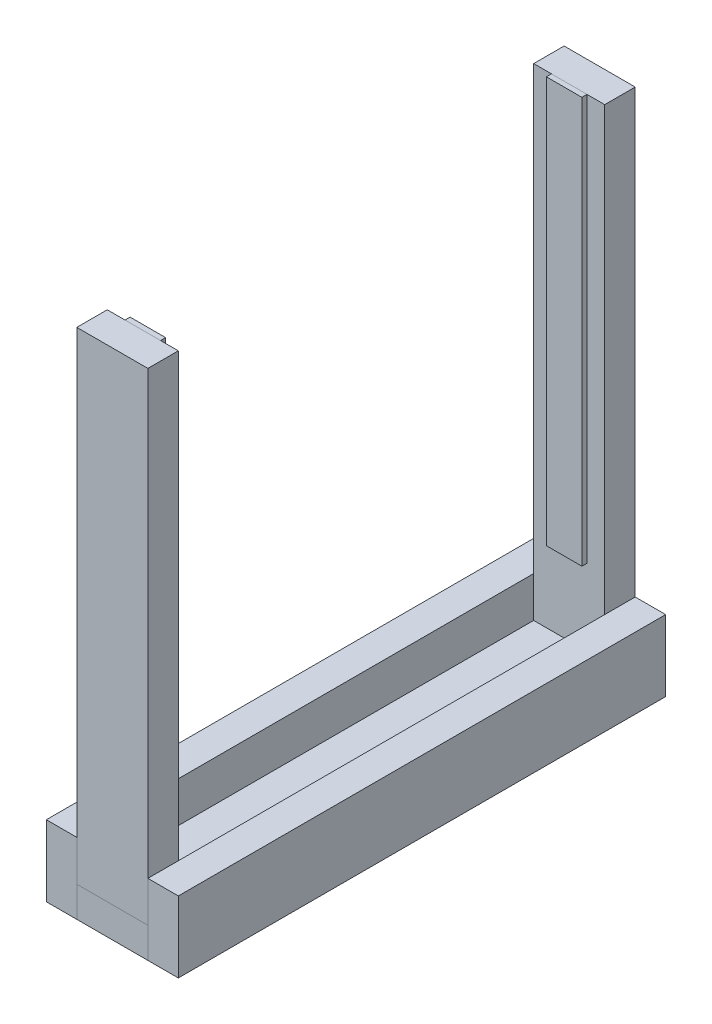
ISO-10303-21;
HEADER;
FILE_DESCRIPTION(('STEP AP214'),'2;1');
FILE_NAME('part.step','',(''),(''),'','','');
FILE_SCHEMA(('AUTOMOTIVE_DESIGN { 1 0 10303 214 1 1 1 1 }'));
ENDSEC;
DATA;
#1=APPLICATION_CONTEXT('core data for automotive mechanical design processes');
#2=APPLICATION_PROTOCOL_DEFINITION('international standard','automotive_design',2000,#1);
#3=PRODUCT_CONTEXT('',#1,'mechanical');
#4=PRODUCT('Part','Part','',(#3));
#5=PRODUCT_RELATED_PRODUCT_CATEGORY('part','',(#4));
#6=PRODUCT_DEFINITION_FORMATION('','',#4);
#7=PRODUCT_DEFINITION_CONTEXT('part definition',#1,'design');
#8=PRODUCT_DEFINITION('design','',#6,#7);
#9=PRODUCT_DEFINITION_SHAPE('','',#8);
#10=(LENGTH_UNIT() NAMED_UNIT(*) SI_UNIT(.MILLI.,.METRE.));
#11=(NAMED_UNIT(*) PLANE_ANGLE_UNIT() SI_UNIT($,.RADIAN.));
#12=(NAMED_UNIT(*) SI_UNIT($,.STERADIAN.) SOLID_ANGLE_UNIT());
#13=UNCERTAINTY_MEASURE_WITH_UNIT(LENGTH_MEASURE(1.E-05),#10,'distance_accuracy_value','');
#14=(GEOMETRIC_REPRESENTATION_CONTEXT(3) GLOBAL_UNCERTAINTY_ASSIGNED_CONTEXT((#13)) GLOBAL_UNIT_ASSIGNED_CONTEXT((#10,
#11,#12)) REPRESENTATION_CONTEXT('',''));
#15=CARTESIAN_POINT('',(0.,0.,0.));
#16=DIRECTION('',(0.,0.,1.));
#17=DIRECTION('',(1.,0.,0.));
#18=AXIS2_PLACEMENT_3D('',#15,#16,#17);
#19=CARTESIAN_POINT('',(22.225,641.35,-260.35));
#20=DIRECTION('',(-1.,0.,0.));
#21=DIRECTION('',(0.,-1.,0.));
#22=AXIS2_PLACEMENT_3D('',#19,#20,#21);
#23=PLANE('',#22);
#24=DIRECTION('',(0.,-1.,0.));
#25=VECTOR('',#24,1.);
#26=CARTESIAN_POINT('',(22.225,641.35,-266.7));
#27=LINE('',#26,#25);
#28=CARTESIAN_POINT('',(22.225,641.35,-266.7));
#29=VERTEX_POINT('',#28);
#30=CARTESIAN_POINT('',(22.2249999999999,133.35,-266.7));
#31=VERTEX_POINT('',#30);
#32=EDGE_CURVE('E109',#29,#31,#27,.T.);
#33=ORIENTED_EDGE('',*,*,#32,.F.);
#34=DIRECTION('',(0.,0.,-1.));
#35=VECTOR('',#34,1.);
#36=CARTESIAN_POINT('',(22.225,641.35,-260.35));
#37=LINE('',#36,#35);
#38=CARTESIAN_POINT('',(22.225,641.35,-260.35));
#39=VERTEX_POINT('',#38);
#40=EDGE_CURVE('E108',#39,#29,#37,.T.);
#41=ORIENTED_EDGE('',*,*,#40,.F.);
#42=DIRECTION('',(0.,-1.,0.));
#43=VECTOR('',#42,1.);
#44=CARTESIAN_POINT('',(22.225,641.35,-260.35));
#45=LINE('',#44,#43);
#46=CARTESIAN_POINT('',(22.2249999999999,133.35,-260.35));
#47=VERTEX_POINT('',#46);
#48=EDGE_CURVE('E103',#39,#47,#45,.T.);
#49=ORIENTED_EDGE('',*,*,#48,.T.);
#50=DIRECTION('',(0.,0.,-1.));
#51=VECTOR('',#50,1.);
#52=CARTESIAN_POINT('',(22.2249999999999,133.35,-260.35));
#53=LINE('',#52,#51);
#54=EDGE_CURVE('E12',#47,#31,#53,.T.);
#55=ORIENTED_EDGE('',*,*,#54,.T.);
#56=EDGE_LOOP('',(#33,#41,#49,#55));
#57=FACE_BOUND('',#56,.T.);
#58=ADVANCED_FACE('F46',(#57),#23,.F.);
#59=CARTESIAN_POINT('',(22.2249999999999,133.35,-260.35));
#60=DIRECTION('',(0.,1.,0.));
#61=DIRECTION('',(0.,0.,-1.));
#62=AXIS2_PLACEMENT_3D('',#59,#60,#61);
#63=PLANE('',#62);
#64=DIRECTION('',(-1.,0.,0.));
#65=VECTOR('',#64,1.);
#66=CARTESIAN_POINT('',(22.2249999999999,133.35,-266.7));
#67=LINE('',#66,#65);
#68=CARTESIAN_POINT('',(-22.2249999999999,133.35,-266.7));
#69=VERTEX_POINT('',#68);
#70=EDGE_CURVE('E111',#31,#69,#67,.T.);
#71=ORIENTED_EDGE('',*,*,#70,.F.);
#72=ORIENTED_EDGE('',*,*,#54,.F.);
#73=DIRECTION('',(-1.,0.,0.));
#74=VECTOR('',#73,1.);
#75=CARTESIAN_POINT('',(22.2249999999999,133.35,-260.35));
#76=LINE('',#75,#74);
#77=CARTESIAN_POINT('',(-22.2249999999999,133.35,-260.35));
#78=VERTEX_POINT('',#77);
#79=EDGE_CURVE('E87',#47,#78,#76,.T.);
#80=ORIENTED_EDGE('',*,*,#79,.T.);
#81=DIRECTION('',(0.,0.,-1.));
#82=VECTOR('',#81,1.);
#83=CARTESIAN_POINT('',(-22.2249999999999,133.35,-260.35));
#84=LINE('',#83,#82);
#85=EDGE_CURVE('E54',#78,#69,#84,.T.);
#86=ORIENTED_EDGE('',*,*,#85,.T.);
#87=EDGE_LOOP('',(#71,#72,#80,#86));
#88=FACE_BOUND('',#87,.T.);
#89=ADVANCED_FACE('F101',(#88),#63,.F.);
#90=CARTESIAN_POINT('',(-22.225,641.35,-260.35));
#91=DIRECTION('',(1.,0.,0.));
#92=DIRECTION('',(0.,1.,0.));
#93=AXIS2_PLACEMENT_3D('',#90,#91,#92);
#94=PLANE('',#93);
#95=DIRECTION('',(0.,1.,0.));
#96=VECTOR('',#95,1.);
#97=CARTESIAN_POINT('',(-22.225,641.35,-266.7));
#98=LINE('',#97,#96);
#99=CARTESIAN_POINT('',(-22.225,641.35,-266.7));
#100=VERTEX_POINT('',#99);
#101=EDGE_CURVE('E97',#69,#100,#98,.T.);
#102=ORIENTED_EDGE('',*,*,#101,.F.);
#103=ORIENTED_EDGE('',*,*,#85,.F.);
#104=DIRECTION('',(0.,1.,0.));
#105=VECTOR('',#104,1.);
#106=CARTESIAN_POINT('',(-22.225,641.35,-260.35));
#107=LINE('',#106,#105);
#108=CARTESIAN_POINT('',(-22.225,641.35,-260.35));
#109=VERTEX_POINT('',#108);
#110=EDGE_CURVE('E90',#78,#109,#107,.T.);
#111=ORIENTED_EDGE('',*,*,#110,.T.);
#112=DIRECTION('',(0.,0.,-1.));
#113=VECTOR('',#112,1.);
#114=CARTESIAN_POINT('',(-22.225,641.35,-260.35));
#115=LINE('',#114,#113);
#116=EDGE_CURVE('E100',#109,#100,#115,.T.);
#117=ORIENTED_EDGE('',*,*,#116,.T.);
#118=EDGE_LOOP('',(#102,#103,#111,#117));
#119=FACE_BOUND('',#118,.T.);
#120=ADVANCED_FACE('F96',(#119),#94,.F.);
#121=CARTESIAN_POINT('',(22.225,641.35,-260.35));
#122=DIRECTION('',(0.,-1.,0.));
#123=DIRECTION('',(0.,0.,1.));
#124=AXIS2_PLACEMENT_3D('',#121,#122,#123);
#125=PLANE('',#124);
#126=DIRECTION('',(1.,0.,0.));
#127=VECTOR('',#126,1.);
#128=CARTESIAN_POINT('',(22.225,641.35,-266.7));
#129=LINE('',#128,#127);
#130=EDGE_CURVE('E76',#100,#29,#129,.T.);
#131=ORIENTED_EDGE('',*,*,#130,.F.);
#132=ORIENTED_EDGE('',*,*,#116,.F.);
#133=DIRECTION('',(1.,0.,0.));
#134=VECTOR('',#133,1.);
#135=CARTESIAN_POINT('',(22.225,641.35,-260.35));
#136=LINE('',#135,#134);
#137=EDGE_CURVE('E62',#109,#39,#136,.T.);
#138=ORIENTED_EDGE('',*,*,#137,.T.);
#139=ORIENTED_EDGE('',*,*,#40,.T.);
#140=EDGE_LOOP('',(#131,#132,#138,#139));
#141=FACE_BOUND('',#140,.T.);
#142=ADVANCED_FACE('F120',(#141),#125,.F.);
#143=CARTESIAN_POINT('',(0.,0.,-260.35));
#144=DIRECTION('',(0.,0.,1.));
#145=DIRECTION('',(-1.,0.,0.));
#146=AXIS2_PLACEMENT_3D('',#143,#144,#145);
#147=PLANE('',#146);
#148=ORIENTED_EDGE('',*,*,#48,.F.);
#149=ORIENTED_EDGE('',*,*,#137,.F.);
#150=ORIENTED_EDGE('',*,*,#110,.F.);
#151=ORIENTED_EDGE('',*,*,#79,.F.);
#152=EDGE_LOOP('',(#148,#149,#150,#151));
#153=FACE_BOUND('',#152,.T.);
#154=ADVANCED_FACE('F92',(#153),#147,.T.);
#155=CARTESIAN_POINT('',(0.,0.,-266.7));
#156=DIRECTION('',(0.,0.,1.));
#157=DIRECTION('',(-1.,0.,0.));
#158=AXIS2_PLACEMENT_3D('',#155,#156,#157);
#159=PLANE('',#158);
#160=ORIENTED_EDGE('',*,*,#32,.T.);
#161=ORIENTED_EDGE('',*,*,#70,.T.);
#162=ORIENTED_EDGE('',*,*,#101,.T.);
#163=ORIENTED_EDGE('',*,*,#130,.T.);
#164=EDGE_LOOP('',(#160,#161,#162,#163));
#165=FACE_BOUND('',#164,.T.);
#166=ADVANCED_FACE('F116',(#165),#159,.F.);
#167=CLOSED_SHELL('',(#58,#89,#120,#142,#154,#166));
#168=MANIFOLD_SOLID_BREP('B2',#167);
#169=CARTESIAN_POINT('',(22.225,641.35,260.35));
#170=DIRECTION('',(-1.,0.,0.));
#171=DIRECTION('',(0.,-1.,0.));
#172=AXIS2_PLACEMENT_3D('',#169,#170,#171);
#173=PLANE('',#172);
#174=DIRECTION('',(0.,-1.,0.));
#175=VECTOR('',#174,1.);
#176=CARTESIAN_POINT('',(22.225,641.35,266.7));
#177=LINE('',#176,#175);
#178=CARTESIAN_POINT('',(22.225,641.35,266.7));
#179=VERTEX_POINT('',#178);
#180=CARTESIAN_POINT('',(22.2249999999999,133.35,266.7));
#181=VERTEX_POINT('',#180);
#182=EDGE_CURVE('E255',#179,#181,#177,.T.);
#183=ORIENTED_EDGE('',*,*,#182,.T.);
#184=DIRECTION('',(0.,0.,1.));
#185=VECTOR('',#184,1.);
#186=CARTESIAN_POINT('',(22.2249999999999,133.35,260.35));
#187=LINE('',#186,#185);
#188=CARTESIAN_POINT('',(22.2249999999999,133.35,260.35));
#189=VERTEX_POINT('',#188);
#190=EDGE_CURVE('E44',#189,#181,#187,.T.);
#191=ORIENTED_EDGE('',*,*,#190,.F.);
#192=DIRECTION('',(0.,-1.,0.));
#193=VECTOR('',#192,1.);
#194=CARTESIAN_POINT('',(22.225,641.35,260.35));
#195=LINE('',#194,#193);
#196=CARTESIAN_POINT('',(22.225,641.35,260.35));
#197=VERTEX_POINT('',#196);
#198=EDGE_CURVE('E243',#197,#189,#195,.T.);
#199=ORIENTED_EDGE('',*,*,#198,.F.);
#200=DIRECTION('',(0.,0.,1.));
#201=VECTOR('',#200,1.);
#202=CARTESIAN_POINT('',(22.225,641.35,260.35));
#203=LINE('',#202,#201);
#204=EDGE_CURVE('E251',#197,#179,#203,.T.);
#205=ORIENTED_EDGE('',*,*,#204,.T.);
#206=EDGE_LOOP('',(#183,#191,#199,#205));
#207=FACE_BOUND('',#206,.T.);
#208=ADVANCED_FACE('F192',(#207),#173,.F.);
#209=CARTESIAN_POINT('',(22.2249999999999,133.35,260.35));
#210=DIRECTION('',(0.,1.,0.));
#211=DIRECTION('',(0.,0.,1.));
#212=AXIS2_PLACEMENT_3D('',#209,#210,#211);
#213=PLANE('',#212);
#214=DIRECTION('',(-1.,0.,0.));
#215=VECTOR('',#214,1.);
#216=CARTESIAN_POINT('',(22.2249999999999,133.35,266.7));
#217=LINE('',#216,#215);
#218=CARTESIAN_POINT('',(-22.2249999999999,133.35,266.7));
#219=VERTEX_POINT('',#218);
#220=EDGE_CURVE('E247',#181,#219,#217,.T.);
#221=ORIENTED_EDGE('',*,*,#220,.T.);
#222=DIRECTION('',(0.,0.,1.));
#223=VECTOR('',#222,1.);
#224=CARTESIAN_POINT('',(-22.2249999999999,133.35,260.35));
#225=LINE('',#224,#223);
#226=CARTESIAN_POINT('',(-22.2249999999999,133.35,260.35));
#227=VERTEX_POINT('',#226);
#228=EDGE_CURVE('E200',#227,#219,#225,.T.);
#229=ORIENTED_EDGE('',*,*,#228,.F.);
#230=DIRECTION('',(-1.,0.,0.));
#231=VECTOR('',#230,1.);
#232=CARTESIAN_POINT('',(22.2249999999999,133.35,260.35));
#233=LINE('',#232,#231);
#234=EDGE_CURVE('E238',#189,#227,#233,.T.);
#235=ORIENTED_EDGE('',*,*,#234,.F.);
#236=ORIENTED_EDGE('',*,*,#190,.T.);
#237=EDGE_LOOP('',(#221,#229,#235,#236));
#238=FACE_BOUND('',#237,.T.);
#239=ADVANCED_FACE('F246',(#238),#213,.F.);
#240=CARTESIAN_POINT('',(-22.225,641.35,260.35));
#241=DIRECTION('',(1.,0.,0.));
#242=DIRECTION('',(0.,1.,0.));
#243=AXIS2_PLACEMENT_3D('',#240,#241,#242);
#244=PLANE('',#243);
#245=DIRECTION('',(0.,1.,0.));
#246=VECTOR('',#245,1.);
#247=CARTESIAN_POINT('',(-22.225,641.35,266.7));
#248=LINE('',#247,#246);
#249=CARTESIAN_POINT('',(-22.225,641.35,266.7));
#250=VERTEX_POINT('',#249);
#251=EDGE_CURVE('E225',#219,#250,#248,.T.);
#252=ORIENTED_EDGE('',*,*,#251,.T.);
#253=DIRECTION('',(0.,0.,1.));
#254=VECTOR('',#253,1.);
#255=CARTESIAN_POINT('',(-22.225,641.35,260.35));
#256=LINE('',#255,#254);
#257=CARTESIAN_POINT('',(-22.225,641.35,260.35));
#258=VERTEX_POINT('',#257);
#259=EDGE_CURVE('E248',#258,#250,#256,.T.);
#260=ORIENTED_EDGE('',*,*,#259,.F.);
#261=DIRECTION('',(0.,1.,0.));
#262=VECTOR('',#261,1.);
#263=CARTESIAN_POINT('',(-22.225,641.35,260.35));
#264=LINE('',#263,#262);
#265=EDGE_CURVE('E241',#227,#258,#264,.T.);
#266=ORIENTED_EDGE('',*,*,#265,.F.);
#267=ORIENTED_EDGE('',*,*,#228,.T.);
#268=EDGE_LOOP('',(#252,#260,#266,#267));
#269=FACE_BOUND('',#268,.T.);
#270=ADVANCED_FACE('F249',(#269),#244,.F.);
#271=CARTESIAN_POINT('',(22.225,641.35,260.35));
#272=DIRECTION('',(0.,-1.,0.));
#273=DIRECTION('',(0.,0.,-1.));
#274=AXIS2_PLACEMENT_3D('',#271,#272,#273);
#275=PLANE('',#274);
#276=DIRECTION('',(1.,0.,0.));
#277=VECTOR('',#276,1.);
#278=CARTESIAN_POINT('',(22.225,641.35,266.7));
#279=LINE('',#278,#277);
#280=EDGE_CURVE('E231',#250,#179,#279,.T.);
#281=ORIENTED_EDGE('',*,*,#280,.T.);
#282=ORIENTED_EDGE('',*,*,#204,.F.);
#283=DIRECTION('',(1.,0.,0.));
#284=VECTOR('',#283,1.);
#285=CARTESIAN_POINT('',(22.225,641.35,260.35));
#286=LINE('',#285,#284);
#287=EDGE_CURVE('E208',#258,#197,#286,.T.);
#288=ORIENTED_EDGE('',*,*,#287,.F.);
#289=ORIENTED_EDGE('',*,*,#259,.T.);
#290=EDGE_LOOP('',(#281,#282,#288,#289));
#291=FACE_BOUND('',#290,.T.);
#292=ADVANCED_FACE('F262',(#291),#275,.F.);
#293=CARTESIAN_POINT('',(0.,0.,260.35));
#294=DIRECTION('',(0.,0.,-1.));
#295=DIRECTION('',(-1.,0.,0.));
#296=AXIS2_PLACEMENT_3D('',#293,#294,#295);
#297=PLANE('',#296);
#298=ORIENTED_EDGE('',*,*,#198,.T.);
#299=ORIENTED_EDGE('',*,*,#234,.T.);
#300=ORIENTED_EDGE('',*,*,#265,.T.);
#301=ORIENTED_EDGE('',*,*,#287,.T.);
#302=EDGE_LOOP('',(#298,#299,#300,#301));
#303=FACE_BOUND('',#302,.T.);
#304=ADVANCED_FACE('F239',(#303),#297,.T.);
#305=CARTESIAN_POINT('',(0.,0.,266.7));
#306=DIRECTION('',(0.,0.,-1.));
#307=DIRECTION('',(-1.,0.,0.));
#308=AXIS2_PLACEMENT_3D('',#305,#306,#307);
#309=PLANE('',#308);
#310=ORIENTED_EDGE('',*,*,#182,.F.);
#311=ORIENTED_EDGE('',*,*,#280,.F.);
#312=ORIENTED_EDGE('',*,*,#251,.F.);
#313=ORIENTED_EDGE('',*,*,#220,.F.);
#314=EDGE_LOOP('',(#310,#311,#312,#313));
#315=FACE_BOUND('',#314,.T.);
#316=ADVANCED_FACE('F265',(#315),#309,.F.);
#317=CLOSED_SHELL('',(#208,#239,#270,#292,#304,#316));
#318=MANIFOLD_SOLID_BREP('B6',#317);
#319=CARTESIAN_POINT('',(-82.55,0.,304.8));
#320=DIRECTION('',(0.,0.,-1.));
#321=DIRECTION('',(1.,0.,0.));
#322=AXIS2_PLACEMENT_3D('',#319,#320,#321);
#323=PLANE('',#322);
#324=DIRECTION('',(0.,-1.,0.));
#325=VECTOR('',#324,1.);
#326=CARTESIAN_POINT('',(-44.45,0.,304.8));
#327=LINE('',#326,#325);
#328=CARTESIAN_POINT('',(-44.45,88.9,304.8));
#329=VERTEX_POINT('',#328);
#330=CARTESIAN_POINT('',(-44.45,0.,304.8));
#331=VERTEX_POINT('',#330);
#332=EDGE_CURVE('E389',#329,#331,#327,.T.);
#333=ORIENTED_EDGE('',*,*,#332,.F.);
#334=DIRECTION('',(1.,0.,0.));
#335=VECTOR('',#334,1.);
#336=CARTESIAN_POINT('',(-82.55,88.9,304.8));
#337=LINE('',#336,#335);
#338=CARTESIAN_POINT('',(-82.55,88.9,304.8));
#339=VERTEX_POINT('',#338);
#340=EDGE_CURVE('E388',#339,#329,#337,.T.);
#341=ORIENTED_EDGE('',*,*,#340,.F.);
#342=DIRECTION('',(0.,-1.,0.));
#343=VECTOR('',#342,1.);
#344=CARTESIAN_POINT('',(-82.55,0.,304.8));
#345=LINE('',#344,#343);
#346=CARTESIAN_POINT('',(-82.55,0.,304.8));
#347=VERTEX_POINT('',#346);
#348=EDGE_CURVE('E383',#339,#347,#345,.T.);
#349=ORIENTED_EDGE('',*,*,#348,.T.);
#350=DIRECTION('',(1.,0.,0.));
#351=VECTOR('',#350,1.);
#352=CARTESIAN_POINT('',(-82.55,0.,304.8));
#353=LINE('',#352,#351);
#354=EDGE_CURVE('E190',#347,#331,#353,.T.);
#355=ORIENTED_EDGE('',*,*,#354,.T.);
#356=EDGE_LOOP('',(#333,#341,#349,#355));
#357=FACE_BOUND('',#356,.T.);
#358=ADVANCED_FACE('F326',(#357),#323,.F.);
#359=CARTESIAN_POINT('',(-82.55,0.,304.8));
#360=DIRECTION('',(0.,1.,0.));
#361=DIRECTION('',(0.,0.,1.));
#362=AXIS2_PLACEMENT_3D('',#359,#360,#361);
#363=PLANE('',#362);
#364=DIRECTION('',(0.,0.,-1.));
#365=VECTOR('',#364,1.);
#366=CARTESIAN_POINT('',(-44.45,0.,304.8));
#367=LINE('',#366,#365);
#368=CARTESIAN_POINT('',(-44.45,0.,-304.8));
#369=VERTEX_POINT('',#368);
#370=EDGE_CURVE('E391',#331,#369,#367,.T.);
#371=ORIENTED_EDGE('',*,*,#370,.F.);
#372=ORIENTED_EDGE('',*,*,#354,.F.);
#373=DIRECTION('',(0.,0.,-1.));
#374=VECTOR('',#373,1.);
#375=CARTESIAN_POINT('',(-82.55,0.,304.8));
#376=LINE('',#375,#374);
#377=CARTESIAN_POINT('',(-82.55,0.,-304.8));
#378=VERTEX_POINT('',#377);
#379=EDGE_CURVE('E367',#347,#378,#376,.T.);
#380=ORIENTED_EDGE('',*,*,#379,.T.);
#381=DIRECTION('',(1.,0.,0.));
#382=VECTOR('',#381,1.);
#383=CARTESIAN_POINT('',(-82.55,0.,-304.8));
#384=LINE('',#383,#382);
#385=EDGE_CURVE('E334',#378,#369,#384,.T.);
#386=ORIENTED_EDGE('',*,*,#385,.T.);
#387=EDGE_LOOP('',(#371,#372,#380,#386));
#388=FACE_BOUND('',#387,.T.);
#389=ADVANCED_FACE('F381',(#388),#363,.F.);
#390=CARTESIAN_POINT('',(-82.55,0.,-304.8));
#391=DIRECTION('',(0.,0.,1.));
#392=DIRECTION('',(-1.,0.,0.));
#393=AXIS2_PLACEMENT_3D('',#390,#391,#392);
#394=PLANE('',#393);
#395=DIRECTION('',(0.,1.,0.));
#396=VECTOR('',#395,1.);
#397=CARTESIAN_POINT('',(-44.45,0.,-304.8));
#398=LINE('',#397,#396);
#399=CARTESIAN_POINT('',(-44.45,88.9,-304.8));
#400=VERTEX_POINT('',#399);
#401=EDGE_CURVE('E377',#369,#400,#398,.T.);
#402=ORIENTED_EDGE('',*,*,#401,.F.);
#403=ORIENTED_EDGE('',*,*,#385,.F.);
#404=DIRECTION('',(0.,1.,0.));
#405=VECTOR('',#404,1.);
#406=CARTESIAN_POINT('',(-82.55,0.,-304.8));
#407=LINE('',#406,#405);
#408=CARTESIAN_POINT('',(-82.55,88.9,-304.8));
#409=VERTEX_POINT('',#408);
#410=EDGE_CURVE('E370',#378,#409,#407,.T.);
#411=ORIENTED_EDGE('',*,*,#410,.T.);
#412=DIRECTION('',(1.,0.,0.));
#413=VECTOR('',#412,1.);
#414=CARTESIAN_POINT('',(-82.55,88.9,-304.8));
#415=LINE('',#414,#413);
#416=EDGE_CURVE('E380',#409,#400,#415,.T.);
#417=ORIENTED_EDGE('',*,*,#416,.T.);
#418=EDGE_LOOP('',(#402,#403,#411,#417));
#419=FACE_BOUND('',#418,.T.);
#420=ADVANCED_FACE('F376',(#419),#394,.F.);
#421=CARTESIAN_POINT('',(-82.55,88.9,304.8));
#422=DIRECTION('',(0.,-1.,0.));
#423=DIRECTION('',(0.,0.,-1.));
#424=AXIS2_PLACEMENT_3D('',#421,#422,#423);
#425=PLANE('',#424);
#426=DIRECTION('',(0.,0.,1.));
#427=VECTOR('',#426,1.);
#428=CARTESIAN_POINT('',(-44.45,88.9,304.8));
#429=LINE('',#428,#427);
#430=EDGE_CURVE('E356',#400,#329,#429,.T.);
#431=ORIENTED_EDGE('',*,*,#430,.F.);
#432=ORIENTED_EDGE('',*,*,#416,.F.);
#433=DIRECTION('',(0.,0.,1.));
#434=VECTOR('',#433,1.);
#435=CARTESIAN_POINT('',(-82.55,88.9,304.8));
#436=LINE('',#435,#434);
#437=EDGE_CURVE('E342',#409,#339,#436,.T.);
#438=ORIENTED_EDGE('',*,*,#437,.T.);
#439=ORIENTED_EDGE('',*,*,#340,.T.);
#440=EDGE_LOOP('',(#431,#432,#438,#439));
#441=FACE_BOUND('',#440,.T.);
#442=ADVANCED_FACE('F400',(#441),#425,.F.);
#443=CARTESIAN_POINT('',(-82.55,0.,0.));
#444=DIRECTION('',(1.,0.,0.));
#445=DIRECTION('',(0.,0.,1.));
#446=AXIS2_PLACEMENT_3D('',#443,#444,#445);
#447=PLANE('',#446);
#448=ORIENTED_EDGE('',*,*,#348,.F.);
#449=ORIENTED_EDGE('',*,*,#437,.F.);
#450=ORIENTED_EDGE('',*,*,#410,.F.);
#451=ORIENTED_EDGE('',*,*,#379,.F.);
#452=EDGE_LOOP('',(#448,#449,#450,#451));
#453=FACE_BOUND('',#452,.T.);
#454=ADVANCED_FACE('F372',(#453),#447,.F.);
#455=CARTESIAN_POINT('',(-44.45,0.,0.));
#456=DIRECTION('',(1.,0.,0.));
#457=DIRECTION('',(0.,0.,1.));
#458=AXIS2_PLACEMENT_3D('',#455,#456,#457);
#459=PLANE('',#458);
#460=ORIENTED_EDGE('',*,*,#332,.T.);
#461=ORIENTED_EDGE('',*,*,#370,.T.);
#462=ORIENTED_EDGE('',*,*,#401,.T.);
#463=ORIENTED_EDGE('',*,*,#430,.T.);
#464=EDGE_LOOP('',(#460,#461,#462,#463));
#465=FACE_BOUND('',#464,.T.);
#466=ADVANCED_FACE('F396',(#465),#459,.T.);
#467=CLOSED_SHELL('',(#358,#389,#420,#442,#454,#466));
#468=MANIFOLD_SOLID_BREP('B38',#467);
#469=CARTESIAN_POINT('',(82.55,0.,304.8));
#470=DIRECTION('',(0.,0.,-1.));
#471=DIRECTION('',(-1.,0.,0.));
#472=AXIS2_PLACEMENT_3D('',#469,#470,#471);
#473=PLANE('',#472);
#474=DIRECTION('',(0.,-1.,0.));
#475=VECTOR('',#474,1.);
#476=CARTESIAN_POINT('',(44.45,0.,304.8));
#477=LINE('',#476,#475);
#478=CARTESIAN_POINT('',(44.45,88.9,304.8));
#479=VERTEX_POINT('',#478);
#480=CARTESIAN_POINT('',(44.45,0.,304.8));
#481=VERTEX_POINT('',#480);
#482=EDGE_CURVE('E523',#479,#481,#477,.T.);
#483=ORIENTED_EDGE('',*,*,#482,.T.);
#484=DIRECTION('',(-1.,0.,0.));
#485=VECTOR('',#484,1.);
#486=CARTESIAN_POINT('',(82.55,0.,304.8));
#487=LINE('',#486,#485);
#488=CARTESIAN_POINT('',(82.55,0.,304.8));
#489=VERTEX_POINT('',#488);
#490=EDGE_CURVE('E324',#489,#481,#487,.T.);
#491=ORIENTED_EDGE('',*,*,#490,.F.);
#492=DIRECTION('',(0.,-1.,0.));
#493=VECTOR('',#492,1.);
#494=CARTESIAN_POINT('',(82.55,0.,304.8));
#495=LINE('',#494,#493);
#496=CARTESIAN_POINT('',(82.55,88.9,304.8));
#497=VERTEX_POINT('',#496);
#498=EDGE_CURVE('E511',#497,#489,#495,.T.);
#499=ORIENTED_EDGE('',*,*,#498,.F.);
#500=DIRECTION('',(-1.,0.,0.));
#501=VECTOR('',#500,1.);
#502=CARTESIAN_POINT('',(82.55,88.9,304.8));
#503=LINE('',#502,#501);
#504=EDGE_CURVE('E519',#497,#479,#503,.T.);
#505=ORIENTED_EDGE('',*,*,#504,.T.);
#506=EDGE_LOOP('',(#483,#491,#499,#505));
#507=FACE_BOUND('',#506,.T.);
#508=ADVANCED_FACE('F460',(#507),#473,.F.);
#509=CARTESIAN_POINT('',(82.55,0.,304.8));
#510=DIRECTION('',(0.,1.,0.));
#511=DIRECTION('',(0.,0.,1.));
#512=AXIS2_PLACEMENT_3D('',#509,#510,#511);
#513=PLANE('',#512);
#514=DIRECTION('',(0.,0.,-1.));
#515=VECTOR('',#514,1.);
#516=CARTESIAN_POINT('',(44.45,0.,304.8));
#517=LINE('',#516,#515);
#518=CARTESIAN_POINT('',(44.45,0.,-304.8));
#519=VERTEX_POINT('',#518);
#520=EDGE_CURVE('E515',#481,#519,#517,.T.);
#521=ORIENTED_EDGE('',*,*,#520,.T.);
#522=DIRECTION('',(-1.,0.,0.));
#523=VECTOR('',#522,1.);
#524=CARTESIAN_POINT('',(82.55,0.,-304.8));
#525=LINE('',#524,#523);
#526=CARTESIAN_POINT('',(82.55,0.,-304.8));
#527=VERTEX_POINT('',#526);
#528=EDGE_CURVE('E468',#527,#519,#525,.T.);
#529=ORIENTED_EDGE('',*,*,#528,.F.);
#530=DIRECTION('',(0.,0.,-1.));
#531=VECTOR('',#530,1.);
#532=CARTESIAN_POINT('',(82.55,0.,304.8));
#533=LINE('',#532,#531);
#534=EDGE_CURVE('E506',#489,#527,#533,.T.);
#535=ORIENTED_EDGE('',*,*,#534,.F.);
#536=ORIENTED_EDGE('',*,*,#490,.T.);
#537=EDGE_LOOP('',(#521,#529,#535,#536));
#538=FACE_BOUND('',#537,.T.);
#539=ADVANCED_FACE('F514',(#538),#513,.F.);
#540=CARTESIAN_POINT('',(82.55,0.,-304.8));
#541=DIRECTION('',(0.,0.,1.));
#542=DIRECTION('',(1.,0.,0.));
#543=AXIS2_PLACEMENT_3D('',#540,#541,#542);
#544=PLANE('',#543);
#545=DIRECTION('',(0.,1.,0.));
#546=VECTOR('',#545,1.);
#547=CARTESIAN_POINT('',(44.45,0.,-304.8));
#548=LINE('',#547,#546);
#549=CARTESIAN_POINT('',(44.45,88.9,-304.8));
#550=VERTEX_POINT('',#549);
#551=EDGE_CURVE('E493',#519,#550,#548,.T.);
#552=ORIENTED_EDGE('',*,*,#551,.T.);
#553=DIRECTION('',(-1.,0.,0.));
#554=VECTOR('',#553,1.);
#555=CARTESIAN_POINT('',(82.55,88.9,-304.8));
#556=LINE('',#555,#554);
#557=CARTESIAN_POINT('',(82.55,88.9,-304.8));
#558=VERTEX_POINT('',#557);
#559=EDGE_CURVE('E516',#558,#550,#556,.T.);
#560=ORIENTED_EDGE('',*,*,#559,.F.);
#561=DIRECTION('',(0.,1.,0.));
#562=VECTOR('',#561,1.);
#563=CARTESIAN_POINT('',(82.55,0.,-304.8));
#564=LINE('',#563,#562);
#565=EDGE_CURVE('E509',#527,#558,#564,.T.);
#566=ORIENTED_EDGE('',*,*,#565,.F.);
#567=ORIENTED_EDGE('',*,*,#528,.T.);
#568=EDGE_LOOP('',(#552,#560,#566,#567));
#569=FACE_BOUND('',#568,.T.);
#570=ADVANCED_FACE('F517',(#569),#544,.F.);
#571=CARTESIAN_POINT('',(82.55,88.9,304.8));
#572=DIRECTION('',(0.,-1.,0.));
#573=DIRECTION('',(0.,0.,-1.));
#574=AXIS2_PLACEMENT_3D('',#571,#572,#573);
#575=PLANE('',#574);
#576=DIRECTION('',(0.,0.,1.));
#577=VECTOR('',#576,1.);
#578=CARTESIAN_POINT('',(44.45,88.9,304.8));
#579=LINE('',#578,#577);
#580=EDGE_CURVE('E499',#550,#479,#579,.T.);
#581=ORIENTED_EDGE('',*,*,#580,.T.);
#582=ORIENTED_EDGE('',*,*,#504,.F.);
#583=DIRECTION('',(0.,0.,1.));
#584=VECTOR('',#583,1.);
#585=CARTESIAN_POINT('',(82.55,88.9,304.8));
#586=LINE('',#585,#584);
#587=EDGE_CURVE('E476',#558,#497,#586,.T.);
#588=ORIENTED_EDGE('',*,*,#587,.F.);
#589=ORIENTED_EDGE('',*,*,#559,.T.);
#590=EDGE_LOOP('',(#581,#582,#588,#589));
#591=FACE_BOUND('',#590,.T.);
#592=ADVANCED_FACE('F530',(#591),#575,.F.);
#593=CARTESIAN_POINT('',(82.55,0.,0.));
#594=DIRECTION('',(-1.,0.,0.));
#595=DIRECTION('',(0.,0.,1.));
#596=AXIS2_PLACEMENT_3D('',#593,#594,#595);
#597=PLANE('',#596);
#598=ORIENTED_EDGE('',*,*,#498,.T.);
#599=ORIENTED_EDGE('',*,*,#534,.T.);
#600=ORIENTED_EDGE('',*,*,#565,.T.);
#601=ORIENTED_EDGE('',*,*,#587,.T.);
#602=EDGE_LOOP('',(#598,#599,#600,#601));
#603=FACE_BOUND('',#602,.T.);
#604=ADVANCED_FACE('F507',(#603),#597,.F.);
#605=CARTESIAN_POINT('',(44.45,0.,0.));
#606=DIRECTION('',(-1.,0.,0.));
#607=DIRECTION('',(0.,0.,1.));
#608=AXIS2_PLACEMENT_3D('',#605,#606,#607);
#609=PLANE('',#608);
#610=ORIENTED_EDGE('',*,*,#482,.F.);
#611=ORIENTED_EDGE('',*,*,#580,.F.);
#612=ORIENTED_EDGE('',*,*,#551,.F.);
#613=ORIENTED_EDGE('',*,*,#520,.F.);
#614=EDGE_LOOP('',(#610,#611,#612,#613));
#615=FACE_BOUND('',#614,.T.);
#616=ADVANCED_FACE('F533',(#615),#609,.T.);
#617=CLOSED_SHELL('',(#508,#539,#570,#592,#604,#616));
#618=MANIFOLD_SOLID_BREP('B184',#617);
#619=CARTESIAN_POINT('',(44.45,641.35,-304.8));
#620=DIRECTION('',(-1.,0.,0.));
#621=DIRECTION('',(0.,0.,-1.));
#622=AXIS2_PLACEMENT_3D('',#619,#620,#621);
#623=PLANE('',#622);
#624=DIRECTION('',(0.,0.,1.));
#625=VECTOR('',#624,1.);
#626=CARTESIAN_POINT('',(44.45,38.1,-304.8));
#627=LINE('',#626,#625);
#628=CARTESIAN_POINT('',(44.45,38.1,-304.8));
#629=VERTEX_POINT('',#628);
#630=CARTESIAN_POINT('',(44.45,38.1,-266.7));
#631=VERTEX_POINT('',#630);
#632=EDGE_CURVE('E657',#629,#631,#627,.T.);
#633=ORIENTED_EDGE('',*,*,#632,.F.);
#634=DIRECTION('',(0.,-1.,0.));
#635=VECTOR('',#634,1.);
#636=CARTESIAN_POINT('',(44.45,641.35,-304.8));
#637=LINE('',#636,#635);
#638=CARTESIAN_POINT('',(44.45,641.35,-304.8));
#639=VERTEX_POINT('',#638);
#640=EDGE_CURVE('E656',#639,#629,#637,.T.);
#641=ORIENTED_EDGE('',*,*,#640,.F.);
#642=DIRECTION('',(0.,0.,1.));
#643=VECTOR('',#642,1.);
#644=CARTESIAN_POINT('',(44.45,641.35,-304.8));
#645=LINE('',#644,#643);
#646=CARTESIAN_POINT('',(44.45,641.35,-266.7));
#647=VERTEX_POINT('',#646);
#648=EDGE_CURVE('E651',#639,#647,#645,.T.);
#649=ORIENTED_EDGE('',*,*,#648,.T.);
#650=DIRECTION('',(0.,-1.,0.));
#651=VECTOR('',#650,1.);
#652=CARTESIAN_POINT('',(44.45,641.35,-266.7));
#653=LINE('',#652,#651);
#654=EDGE_CURVE('E458',#647,#631,#653,.T.);
#655=ORIENTED_EDGE('',*,*,#654,.T.);
#656=EDGE_LOOP('',(#633,#641,#649,#655));
#657=FACE_BOUND('',#656,.T.);
#658=ADVANCED_FACE('F594',(#657),#623,.F.);
#659=CARTESIAN_POINT('',(44.45,641.35,-266.7));
#660=DIRECTION('',(0.,0.,-1.));
#661=DIRECTION('',(1.,0.,0.));
#662=AXIS2_PLACEMENT_3D('',#659,#660,#661);
#663=PLANE('',#662);
#664=DIRECTION('',(-1.,0.,0.));
#665=VECTOR('',#664,1.);
#666=CARTESIAN_POINT('',(44.45,38.1,-266.7));
#667=LINE('',#666,#665);
#668=CARTESIAN_POINT('',(-44.45,38.1,-266.7));
#669=VERTEX_POINT('',#668);
#670=EDGE_CURVE('E659',#631,#669,#667,.T.);
#671=ORIENTED_EDGE('',*,*,#670,.F.);
#672=ORIENTED_EDGE('',*,*,#654,.F.);
#673=DIRECTION('',(-1.,0.,0.));
#674=VECTOR('',#673,1.);
#675=CARTESIAN_POINT('',(44.45,641.35,-266.7));
#676=LINE('',#675,#674);
#677=CARTESIAN_POINT('',(-44.45,641.35,-266.7));
#678=VERTEX_POINT('',#677);
#679=EDGE_CURVE('E635',#647,#678,#676,.T.);
#680=ORIENTED_EDGE('',*,*,#679,.T.);
#681=DIRECTION('',(0.,-1.,0.));
#682=VECTOR('',#681,1.);
#683=CARTESIAN_POINT('',(-44.45,641.35,-266.7));
#684=LINE('',#683,#682);
#685=EDGE_CURVE('E602',#678,#669,#684,.T.);
#686=ORIENTED_EDGE('',*,*,#685,.T.);
#687=EDGE_LOOP('',(#671,#672,#680,#686));
#688=FACE_BOUND('',#687,.T.);
#689=ADVANCED_FACE('F649',(#688),#663,.F.);
#690=CARTESIAN_POINT('',(-44.45,641.35,-304.8));
#691=DIRECTION('',(1.,0.,0.));
#692=DIRECTION('',(0.,0.,1.));
#693=AXIS2_PLACEMENT_3D('',#690,#691,#692);
#694=PLANE('',#693);
#695=DIRECTION('',(0.,0.,-1.));
#696=VECTOR('',#695,1.);
#697=CARTESIAN_POINT('',(-44.45,38.1,-304.8));
#698=LINE('',#697,#696);
#699=CARTESIAN_POINT('',(-44.45,38.1,-304.8));
#700=VERTEX_POINT('',#699);
#701=EDGE_CURVE('E645',#669,#700,#698,.T.);
#702=ORIENTED_EDGE('',*,*,#701,.F.);
#703=ORIENTED_EDGE('',*,*,#685,.F.);
#704=DIRECTION('',(0.,0.,-1.));
#705=VECTOR('',#704,1.);
#706=CARTESIAN_POINT('',(-44.45,641.35,-304.8));
#707=LINE('',#706,#705);
#708=CARTESIAN_POINT('',(-44.45,641.35,-304.8));
#709=VERTEX_POINT('',#708);
#710=EDGE_CURVE('E638',#678,#709,#707,.T.);
#711=ORIENTED_EDGE('',*,*,#710,.T.);
#712=DIRECTION('',(0.,-1.,0.));
#713=VECTOR('',#712,1.);
#714=CARTESIAN_POINT('',(-44.45,641.35,-304.8));
#715=LINE('',#714,#713);
#716=EDGE_CURVE('E648',#709,#700,#715,.T.);
#717=ORIENTED_EDGE('',*,*,#716,.T.);
#718=EDGE_LOOP('',(#702,#703,#711,#717));
#719=FACE_BOUND('',#718,.T.);
#720=ADVANCED_FACE('F644',(#719),#694,.F.);
#721=CARTESIAN_POINT('',(44.45,641.35,-304.8));
#722=DIRECTION('',(0.,0.,1.));
#723=DIRECTION('',(-1.,0.,0.));
#724=AXIS2_PLACEMENT_3D('',#721,#722,#723);
#725=PLANE('',#724);
#726=DIRECTION('',(1.,0.,0.));
#727=VECTOR('',#726,1.);
#728=CARTESIAN_POINT('',(44.45,38.1,-304.8));
#729=LINE('',#728,#727);
#730=EDGE_CURVE('E624',#700,#629,#729,.T.);
#731=ORIENTED_EDGE('',*,*,#730,.F.);
#732=ORIENTED_EDGE('',*,*,#716,.F.);
#733=DIRECTION('',(1.,0.,0.));
#734=VECTOR('',#733,1.);
#735=CARTESIAN_POINT('',(44.45,641.35,-304.8));
#736=LINE('',#735,#734);
#737=EDGE_CURVE('E610',#709,#639,#736,.T.);
#738=ORIENTED_EDGE('',*,*,#737,.T.);
#739=ORIENTED_EDGE('',*,*,#640,.T.);
#740=EDGE_LOOP('',(#731,#732,#738,#739));
#741=FACE_BOUND('',#740,.T.);
#742=ADVANCED_FACE('F668',(#741),#725,.F.);
#743=CARTESIAN_POINT('',(0.,641.35,0.));
#744=DIRECTION('',(0.,1.,0.));
#745=DIRECTION('',(0.,0.,-1.));
#746=AXIS2_PLACEMENT_3D('',#743,#744,#745);
#747=PLANE('',#746);
#748=ORIENTED_EDGE('',*,*,#648,.F.);
#749=ORIENTED_EDGE('',*,*,#737,.F.);
#750=ORIENTED_EDGE('',*,*,#710,.F.);
#751=ORIENTED_EDGE('',*,*,#679,.F.);
#752=EDGE_LOOP('',(#748,#749,#750,#751));
#753=FACE_BOUND('',#752,.T.);
#754=ADVANCED_FACE('F640',(#753),#747,.T.);
#755=CARTESIAN_POINT('',(0.,38.1,0.));
#756=DIRECTION('',(0.,1.,0.));
#757=DIRECTION('',(0.,0.,-1.));
#758=AXIS2_PLACEMENT_3D('',#755,#756,#757);
#759=PLANE('',#758);
#760=ORIENTED_EDGE('',*,*,#632,.T.);
#761=ORIENTED_EDGE('',*,*,#670,.T.);
#762=ORIENTED_EDGE('',*,*,#701,.T.);
#763=ORIENTED_EDGE('',*,*,#730,.T.);
#764=EDGE_LOOP('',(#760,#761,#762,#763));
#765=FACE_BOUND('',#764,.T.);
#766=ADVANCED_FACE('F664',(#765),#759,.F.);
#767=CLOSED_SHELL('',(#658,#689,#720,#742,#754,#766));
#768=MANIFOLD_SOLID_BREP('B318',#767);
#769=CARTESIAN_POINT('',(44.45,641.35,304.8));
#770=DIRECTION('',(-1.,0.,0.));
#771=DIRECTION('',(0.,0.,1.));
#772=AXIS2_PLACEMENT_3D('',#769,#770,#771);
#773=PLANE('',#772);
#774=DIRECTION('',(0.,0.,-1.));
#775=VECTOR('',#774,1.);
#776=CARTESIAN_POINT('',(44.45,38.1,304.8));
#777=LINE('',#776,#775);
#778=CARTESIAN_POINT('',(44.45,38.1,304.8));
#779=VERTEX_POINT('',#778);
#780=CARTESIAN_POINT('',(44.45,38.1,266.7));
#781=VERTEX_POINT('',#780);
#782=EDGE_CURVE('E790',#779,#781,#777,.T.);
#783=ORIENTED_EDGE('',*,*,#782,.T.);
#784=DIRECTION('',(0.,-1.,0.));
#785=VECTOR('',#784,1.);
#786=CARTESIAN_POINT('',(44.45,641.35,266.7));
#787=LINE('',#786,#785);
#788=CARTESIAN_POINT('',(44.45,641.35,266.7));
#789=VERTEX_POINT('',#788);
#790=EDGE_CURVE('E592',#789,#781,#787,.T.);
#791=ORIENTED_EDGE('',*,*,#790,.F.);
#792=DIRECTION('',(0.,0.,-1.));
#793=VECTOR('',#792,1.);
#794=CARTESIAN_POINT('',(44.45,641.35,304.8));
#795=LINE('',#794,#793);
#796=CARTESIAN_POINT('',(44.45,641.35,304.8));
#797=VERTEX_POINT('',#796);
#798=EDGE_CURVE('E778',#797,#789,#795,.T.);
#799=ORIENTED_EDGE('',*,*,#798,.F.);
#800=DIRECTION('',(0.,-1.,0.));
#801=VECTOR('',#800,1.);
#802=CARTESIAN_POINT('',(44.45,641.35,304.8));
#803=LINE('',#802,#801);
#804=EDGE_CURVE('E786',#797,#779,#803,.T.);
#805=ORIENTED_EDGE('',*,*,#804,.T.);
#806=EDGE_LOOP('',(#783,#791,#799,#805));
#807=FACE_BOUND('',#806,.T.);
#808=ADVANCED_FACE('F727',(#807),#773,.F.);
#809=CARTESIAN_POINT('',(44.45,641.35,266.7));
#810=DIRECTION('',(0.,0.,1.));
#811=DIRECTION('',(1.,0.,0.));
#812=AXIS2_PLACEMENT_3D('',#809,#810,#811);
#813=PLANE('',#812);
#814=DIRECTION('',(-1.,0.,0.));
#815=VECTOR('',#814,1.);
#816=CARTESIAN_POINT('',(44.45,38.1,266.7));
#817=LINE('',#816,#815);
#818=CARTESIAN_POINT('',(-44.45,38.1,266.7));
#819=VERTEX_POINT('',#818);
#820=EDGE_CURVE('E782',#781,#819,#817,.T.);
#821=ORIENTED_EDGE('',*,*,#820,.T.);
#822=DIRECTION('',(0.,-1.,0.));
#823=VECTOR('',#822,1.);
#824=CARTESIAN_POINT('',(-44.45,641.35,266.7));
#825=LINE('',#824,#823);
#826=CARTESIAN_POINT('',(-44.45,641.35,266.7));
#827=VERTEX_POINT('',#826);
#828=EDGE_CURVE('E735',#827,#819,#825,.T.);
#829=ORIENTED_EDGE('',*,*,#828,.F.);
#830=DIRECTION('',(-1.,0.,0.));
#831=VECTOR('',#830,1.);
#832=CARTESIAN_POINT('',(44.45,641.35,266.7));
#833=LINE('',#832,#831);
#834=EDGE_CURVE('E773',#789,#827,#833,.T.);
#835=ORIENTED_EDGE('',*,*,#834,.F.);
#836=ORIENTED_EDGE('',*,*,#790,.T.);
#837=EDGE_LOOP('',(#821,#829,#835,#836));
#838=FACE_BOUND('',#837,.T.);
#839=ADVANCED_FACE('F781',(#838),#813,.F.);
#840=CARTESIAN_POINT('',(-44.45,641.35,304.8));
#841=DIRECTION('',(1.,0.,0.));
#842=DIRECTION('',(0.,0.,-1.));
#843=AXIS2_PLACEMENT_3D('',#840,#841,#842);
#844=PLANE('',#843);
#845=DIRECTION('',(0.,0.,1.));
#846=VECTOR('',#845,1.);
#847=CARTESIAN_POINT('',(-44.45,38.1,304.8));
#848=LINE('',#847,#846);
#849=CARTESIAN_POINT('',(-44.45,38.1,304.8));
#850=VERTEX_POINT('',#849);
#851=EDGE_CURVE('E760',#819,#850,#848,.T.);
#852=ORIENTED_EDGE('',*,*,#851,.T.);
#853=DIRECTION('',(0.,-1.,0.));
#854=VECTOR('',#853,1.);
#855=CARTESIAN_POINT('',(-44.45,641.35,304.8));
#856=LINE('',#855,#854);
#857=CARTESIAN_POINT('',(-44.45,641.35,304.8));
#858=VERTEX_POINT('',#857);
#859=EDGE_CURVE('E783',#858,#850,#856,.T.);
#860=ORIENTED_EDGE('',*,*,#859,.F.);
#861=DIRECTION('',(0.,0.,1.));
#862=VECTOR('',#861,1.);
#863=CARTESIAN_POINT('',(-44.45,641.35,304.8));
#864=LINE('',#863,#862);
#865=EDGE_CURVE('E776',#827,#858,#864,.T.);
#866=ORIENTED_EDGE('',*,*,#865,.F.);
#867=ORIENTED_EDGE('',*,*,#828,.T.);
#868=EDGE_LOOP('',(#852,#860,#866,#867));
#869=FACE_BOUND('',#868,.T.);
#870=ADVANCED_FACE('F784',(#869),#844,.F.);
#871=CARTESIAN_POINT('',(44.45,641.35,304.8));
#872=DIRECTION('',(0.,0.,-1.));
#873=DIRECTION('',(-1.,0.,0.));
#874=AXIS2_PLACEMENT_3D('',#871,#872,#873);
#875=PLANE('',#874);
#876=DIRECTION('',(1.,0.,0.));
#877=VECTOR('',#876,1.);
#878=CARTESIAN_POINT('',(44.45,38.1,304.8));
#879=LINE('',#878,#877);
#880=EDGE_CURVE('E766',#850,#779,#879,.T.);
#881=ORIENTED_EDGE('',*,*,#880,.T.);
#882=ORIENTED_EDGE('',*,*,#804,.F.);
#883=DIRECTION('',(1.,0.,0.));
#884=VECTOR('',#883,1.);
#885=CARTESIAN_POINT('',(44.45,641.35,304.8));
#886=LINE('',#885,#884);
#887=EDGE_CURVE('E743',#858,#797,#886,.T.);
#888=ORIENTED_EDGE('',*,*,#887,.F.);
#889=ORIENTED_EDGE('',*,*,#859,.T.);
#890=EDGE_LOOP('',(#881,#882,#888,#889));
#891=FACE_BOUND('',#890,.T.);
#892=ADVANCED_FACE('F797',(#891),#875,.F.);
#893=CARTESIAN_POINT('',(0.,641.35,0.));
#894=DIRECTION('',(0.,1.,0.));
#895=DIRECTION('',(0.,0.,1.));
#896=AXIS2_PLACEMENT_3D('',#893,#894,#895);
#897=PLANE('',#896);
#898=ORIENTED_EDGE('',*,*,#798,.T.);
#899=ORIENTED_EDGE('',*,*,#834,.T.);
#900=ORIENTED_EDGE('',*,*,#865,.T.);
#901=ORIENTED_EDGE('',*,*,#887,.T.);
#902=EDGE_LOOP('',(#898,#899,#900,#901));
#903=FACE_BOUND('',#902,.T.);
#904=ADVANCED_FACE('F774',(#903),#897,.T.);
#905=CARTESIAN_POINT('',(0.,38.1,0.));
#906=DIRECTION('',(0.,1.,0.));
#907=DIRECTION('',(0.,0.,1.));
#908=AXIS2_PLACEMENT_3D('',#905,#906,#907);
#909=PLANE('',#908);
#910=ORIENTED_EDGE('',*,*,#782,.F.);
#911=ORIENTED_EDGE('',*,*,#880,.F.);
#912=ORIENTED_EDGE('',*,*,#851,.F.);
#913=ORIENTED_EDGE('',*,*,#820,.F.);
#914=EDGE_LOOP('',(#910,#911,#912,#913));
#915=FACE_BOUND('',#914,.T.);
#916=ADVANCED_FACE('F800',(#915),#909,.F.);
#917=CLOSED_SHELL('',(#808,#839,#870,#892,#904,#916));
#918=MANIFOLD_SOLID_BREP('B452',#917);
#919=CARTESIAN_POINT('',(44.45,38.1,304.8));
#920=DIRECTION('',(-1.,0.,0.));
#921=DIRECTION('',(0.,0.,1.));
#922=AXIS2_PLACEMENT_3D('',#919,#920,#921);
#923=PLANE('',#922);
#924=DIRECTION('',(0.,0.,-1.));
#925=VECTOR('',#924,1.);
#926=CARTESIAN_POINT('',(44.45,0.,304.8));
#927=LINE('',#926,#925);
#928=CARTESIAN_POINT('',(44.45,0.,304.8));
#929=VERTEX_POINT('',#928);
#930=CARTESIAN_POINT('',(44.45,0.,-304.8));
#931=VERTEX_POINT('',#930);
#932=EDGE_CURVE('E914',#929,#931,#927,.T.);
#933=ORIENTED_EDGE('',*,*,#932,.T.);
#934=DIRECTION('',(0.,-1.,0.));
#935=VECTOR('',#934,1.);
#936=CARTESIAN_POINT('',(44.45,38.1,-304.8));
#937=LINE('',#936,#935);
#938=CARTESIAN_POINT('',(44.45,38.1,-304.8));
#939=VERTEX_POINT('',#938);
#940=EDGE_CURVE('E725',#939,#931,#937,.T.);
#941=ORIENTED_EDGE('',*,*,#940,.F.);
#942=DIRECTION('',(0.,0.,-1.));
#943=VECTOR('',#942,1.);
#944=CARTESIAN_POINT('',(44.45,38.1,304.8));
#945=LINE('',#944,#943);
#946=CARTESIAN_POINT('',(44.45,38.1,304.8));
#947=VERTEX_POINT('',#946);
#948=EDGE_CURVE('E902',#947,#939,#945,.T.);
#949=ORIENTED_EDGE('',*,*,#948,.F.);
#950=DIRECTION('',(0.,-1.,0.));
#951=VECTOR('',#950,1.);
#952=CARTESIAN_POINT('',(44.45,38.1,304.8));
#953=LINE('',#952,#951);
#954=EDGE_CURVE('E910',#947,#929,#953,.T.);
#955=ORIENTED_EDGE('',*,*,#954,.T.);
#956=EDGE_LOOP('',(#933,#941,#949,#955));
#957=FACE_BOUND('',#956,.T.);
#958=ADVANCED_FACE('F851',(#957),#923,.F.);
#959=CARTESIAN_POINT('',(-44.45,38.1,-304.8));
#960=DIRECTION('',(0.,0.,1.));
#961=DIRECTION('',(1.,0.,0.));
#962=AXIS2_PLACEMENT_3D('',#959,#960,#961);
#963=PLANE('',#962);
#964=DIRECTION('',(-1.,0.,0.));
#965=VECTOR('',#964,1.);
#966=CARTESIAN_POINT('',(-44.45,0.,-304.8));
#967=LINE('',#966,#965);
#968=CARTESIAN_POINT('',(-44.45,0.,-304.8));
#969=VERTEX_POINT('',#968);
#970=EDGE_CURVE('E906',#931,#969,#967,.T.);
#971=ORIENTED_EDGE('',*,*,#970,.T.);
#972=DIRECTION('',(0.,-1.,0.));
#973=VECTOR('',#972,1.);
#974=CARTESIAN_POINT('',(-44.45,38.1,-304.8));
#975=LINE('',#974,#973);
#976=CARTESIAN_POINT('',(-44.45,38.1,-304.8));
#977=VERTEX_POINT('',#976);
#978=EDGE_CURVE('E859',#977,#969,#975,.T.);
#979=ORIENTED_EDGE('',*,*,#978,.F.);
#980=DIRECTION('',(-1.,0.,0.));
#981=VECTOR('',#980,1.);
#982=CARTESIAN_POINT('',(-44.45,38.1,-304.8));
#983=LINE('',#982,#981);
#984=EDGE_CURVE('E897',#939,#977,#983,.T.);
#985=ORIENTED_EDGE('',*,*,#984,.F.);
#986=ORIENTED_EDGE('',*,*,#940,.T.);
#987=EDGE_LOOP('',(#971,#979,#985,#986));
#988=FACE_BOUND('',#987,.T.);
#989=ADVANCED_FACE('F905',(#988),#963,.F.);
#990=CARTESIAN_POINT('',(-44.45,38.1,304.8));
#991=DIRECTION('',(1.,0.,0.));
#992=DIRECTION('',(0.,0.,-1.));
#993=AXIS2_PLACEMENT_3D('',#990,#991,#992);
#994=PLANE('',#993);
#995=DIRECTION('',(0.,0.,1.));
#996=VECTOR('',#995,1.);
#997=CARTESIAN_POINT('',(-44.45,0.,304.8));
#998=LINE('',#997,#996);
#999=CARTESIAN_POINT('',(-44.45,0.,304.8));
#1000=VERTEX_POINT('',#999);
#1001=EDGE_CURVE('E884',#969,#1000,#998,.T.);
#1002=ORIENTED_EDGE('',*,*,#1001,.T.);
#1003=DIRECTION('',(0.,-1.,0.));
#1004=VECTOR('',#1003,1.);
#1005=CARTESIAN_POINT('',(-44.45,38.1,304.8));
#1006=LINE('',#1005,#1004);
#1007=CARTESIAN_POINT('',(-44.45,38.1,304.8));
#1008=VERTEX_POINT('',#1007);
#1009=EDGE_CURVE('E907',#1008,#1000,#1006,.T.);
#1010=ORIENTED_EDGE('',*,*,#1009,.F.);
#1011=DIRECTION('',(0.,0.,1.));
#1012=VECTOR('',#1011,1.);
#1013=CARTESIAN_POINT('',(-44.45,38.1,304.8));
#1014=LINE('',#1013,#1012);
#1015=EDGE_CURVE('E900',#977,#1008,#1014,.T.);
#1016=ORIENTED_EDGE('',*,*,#1015,.F.);
#1017=ORIENTED_EDGE('',*,*,#978,.T.);
#1018=EDGE_LOOP('',(#1002,#1010,#1016,#1017));
#1019=FACE_BOUND('',#1018,.T.);
#1020=ADVANCED_FACE('F908',(#1019),#994,.F.);
#1021=CARTESIAN_POINT('',(-44.45,38.1,304.8));
#1022=DIRECTION('',(0.,0.,-1.));
#1023=DIRECTION('',(-1.,0.,0.));
#1024=AXIS2_PLACEMENT_3D('',#1021,#1022,#1023);
#1025=PLANE('',#1024);
#1026=DIRECTION('',(1.,0.,0.));
#1027=VECTOR('',#1026,1.);
#1028=CARTESIAN_POINT('',(-44.45,0.,304.8));
#1029=LINE('',#1028,#1027);
#1030=EDGE_CURVE('E890',#1000,#929,#1029,.T.);
#1031=ORIENTED_EDGE('',*,*,#1030,.T.);
#1032=ORIENTED_EDGE('',*,*,#954,.F.);
#1033=DIRECTION('',(1.,0.,0.));
#1034=VECTOR('',#1033,1.);
#1035=CARTESIAN_POINT('',(-44.45,38.1,304.8));
#1036=LINE('',#1035,#1034);
#1037=EDGE_CURVE('E867',#1008,#947,#1036,.T.);
#1038=ORIENTED_EDGE('',*,*,#1037,.F.);
#1039=ORIENTED_EDGE('',*,*,#1009,.T.);
#1040=EDGE_LOOP('',(#1031,#1032,#1038,#1039));
#1041=FACE_BOUND('',#1040,.T.);
#1042=ADVANCED_FACE('F921',(#1041),#1025,.F.);
#1043=CARTESIAN_POINT('',(0.,38.1,0.));
#1044=DIRECTION('',(0.,-1.,0.));
#1045=DIRECTION('',(0.,0.,-1.));
#1046=AXIS2_PLACEMENT_3D('',#1043,#1044,#1045);
#1047=PLANE('',#1046);
#1048=ORIENTED_EDGE('',*,*,#948,.T.);
#1049=ORIENTED_EDGE('',*,*,#984,.T.);
#1050=ORIENTED_EDGE('',*,*,#1015,.T.);
#1051=ORIENTED_EDGE('',*,*,#1037,.T.);
#1052=EDGE_LOOP('',(#1048,#1049,#1050,#1051));
#1053=FACE_BOUND('',#1052,.T.);
#1054=ADVANCED_FACE('F898',(#1053),#1047,.F.);
#1055=CARTESIAN_POINT('',(0.,0.,0.));
#1056=DIRECTION('',(0.,-1.,0.));
#1057=DIRECTION('',(0.,0.,-1.));
#1058=AXIS2_PLACEMENT_3D('',#1055,#1056,#1057);
#1059=PLANE('',#1058);
#1060=ORIENTED_EDGE('',*,*,#932,.F.);
#1061=ORIENTED_EDGE('',*,*,#1030,.F.);
#1062=ORIENTED_EDGE('',*,*,#1001,.F.);
#1063=ORIENTED_EDGE('',*,*,#970,.F.);
#1064=EDGE_LOOP('',(#1060,#1061,#1062,#1063));
#1065=FACE_BOUND('',#1064,.T.);
#1066=ADVANCED_FACE('F924',(#1065),#1059,.T.);
#1067=CLOSED_SHELL('',(#958,#989,#1020,#1042,#1054,#1066));
#1068=MANIFOLD_SOLID_BREP('B586',#1067);
#1069=ADVANCED_BREP_SHAPE_REPRESENTATION('',(#18,#168,#318,#468,#618,#768,#918,#1068),#14);
#1070=SHAPE_DEFINITION_REPRESENTATION(#9,#1069);
ENDSEC;
END-ISO-10303-21;
